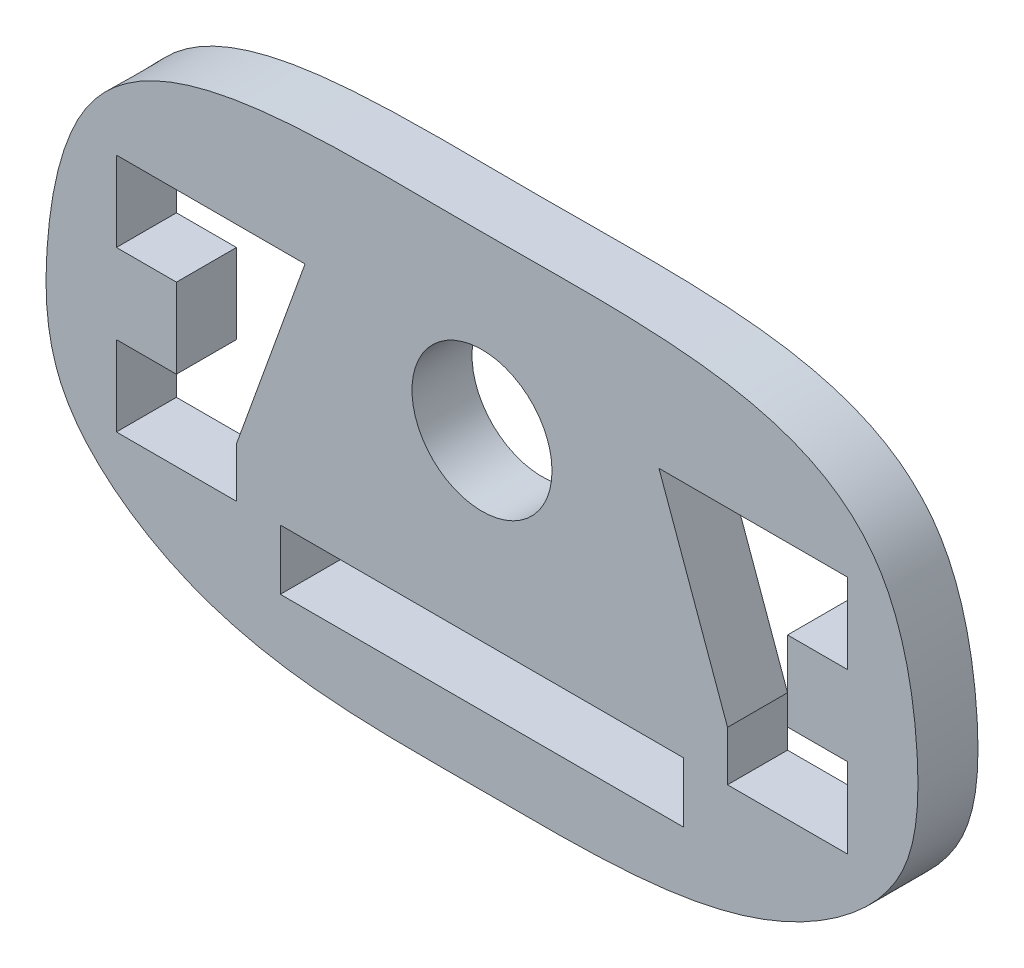
ISO-10303-21;
HEADER;
FILE_DESCRIPTION(('STEP AP214'),'2;1');
FILE_NAME('part.step','',(''),(''),'','','');
FILE_SCHEMA(('AUTOMOTIVE_DESIGN { 1 0 10303 214 1 1 1 1 }'));
ENDSEC;
DATA;
#1=APPLICATION_CONTEXT('core data for automotive mechanical design processes');
#2=APPLICATION_PROTOCOL_DEFINITION('international standard','automotive_design',2000,#1);
#3=PRODUCT_CONTEXT('',#1,'mechanical');
#4=PRODUCT('Part','Part','',(#3));
#5=PRODUCT_RELATED_PRODUCT_CATEGORY('part','',(#4));
#6=PRODUCT_DEFINITION_FORMATION('','',#4);
#7=PRODUCT_DEFINITION_CONTEXT('part definition',#1,'design');
#8=PRODUCT_DEFINITION('design','',#6,#7);
#9=PRODUCT_DEFINITION_SHAPE('','',#8);
#10=(LENGTH_UNIT() NAMED_UNIT(*) SI_UNIT(.MILLI.,.METRE.));
#11=(NAMED_UNIT(*) PLANE_ANGLE_UNIT() SI_UNIT($,.RADIAN.));
#12=(NAMED_UNIT(*) SI_UNIT($,.STERADIAN.) SOLID_ANGLE_UNIT());
#13=UNCERTAINTY_MEASURE_WITH_UNIT(LENGTH_MEASURE(1.E-05),#10,'distance_accuracy_value','');
#14=(GEOMETRIC_REPRESENTATION_CONTEXT(3) GLOBAL_UNCERTAINTY_ASSIGNED_CONTEXT((#13)) GLOBAL_UNIT_ASSIGNED_CONTEXT((#10,
#11,#12)) REPRESENTATION_CONTEXT('',''));
#15=CARTESIAN_POINT('',(0.,0.,0.));
#16=DIRECTION('',(0.,0.,1.));
#17=DIRECTION('',(1.,0.,0.));
#18=AXIS2_PLACEMENT_3D('',#15,#16,#17);
#19=CARTESIAN_POINT('',(0.,8.587,-3.));
#20=CARTESIAN_POINT('',(-8.29531286168411,8.587,-3.));
#21=CARTESIAN_POINT('',(-19.5336080047196,9.37448352417884,-3.));
#22=CARTESIAN_POINT('',(-21.9957741214908,-2.52883560372019,-3.));
#23=CARTESIAN_POINT('',(-21.673613050619,-9.04529162390971,-3.));
#24=CARTESIAN_POINT('',(-13.850048985814,-15.8842034140254,-3.));
#25=CARTESIAN_POINT('',(0.,-15.3682614883277,-3.));
#26=CARTESIAN_POINT('',(13.850048985814,-15.8842034140254,-3.));
#27=CARTESIAN_POINT('',(21.673613050619,-9.04529162390971,-3.));
#28=CARTESIAN_POINT('',(21.9957741214908,-2.52883560372018,-3.));
#29=CARTESIAN_POINT('',(19.5336080047196,9.37448352417884,-3.));
#30=CARTESIAN_POINT('',(8.29531286168411,8.587,-3.));
#31=CARTESIAN_POINT('',(0.,8.587,-3.));
#32=B_SPLINE_CURVE_WITH_KNOTS('',3,(#19,#20,#21,#22,#23,#24,#25,#26,#27,#28,#29,#30,#31),
.UNSPECIFIED.,.T.,.F.,(4,1,1,1,1,1,1,1,1,1,4),(0.,0.181616285688186,0.24604948063783,
0.295476386667812,0.349472823423533,0.5,0.650527176576467,0.704523613332188,0.753950519362169,
0.818383714311814,1.),.UNSPECIFIED.);
#33=DIRECTION('',(0.,0.,1.));
#34=VECTOR('',#33,1.);
#35=SURFACE_OF_LINEAR_EXTRUSION('',#32,#34);
#36=CARTESIAN_POINT('',(0.,8.587,-3.));
#37=VERTEX_POINT('',#36);
#38=EDGE_CURVE('E11',#37,#37,#32,.T.);
#39=ORIENTED_EDGE('',*,*,#38,.T.);
#40=EDGE_LOOP('',(#39));
#41=FACE_BOUND('',#40,.T.);
#42=CARTESIAN_POINT('',(0.,8.587,0.));
#43=CARTESIAN_POINT('',(-8.29531286168411,8.587,0.));
#44=CARTESIAN_POINT('',(-19.5336080047196,9.37448352417884,0.));
#45=CARTESIAN_POINT('',(-21.9957741214908,-2.52883560372019,0.));
#46=CARTESIAN_POINT('',(-21.673613050619,-9.04529162390971,0.));
#47=CARTESIAN_POINT('',(-13.850048985814,-15.8842034140254,0.));
#48=CARTESIAN_POINT('',(0.,-15.3682614883277,0.));
#49=CARTESIAN_POINT('',(13.850048985814,-15.8842034140254,0.));
#50=CARTESIAN_POINT('',(21.673613050619,-9.04529162390971,0.));
#51=CARTESIAN_POINT('',(21.9957741214908,-2.52883560372018,0.));
#52=CARTESIAN_POINT('',(19.5336080047196,9.37448352417884,0.));
#53=CARTESIAN_POINT('',(8.29531286168411,8.587,0.));
#54=CARTESIAN_POINT('',(0.,8.587,0.));
#55=B_SPLINE_CURVE_WITH_KNOTS('',3,(#42,#43,#44,#45,#46,#47,#48,#49,#50,#51,#52,#53,#54),
.UNSPECIFIED.,.T.,.F.,(4,1,1,1,1,1,1,1,1,1,4),(0.,0.181616285688186,0.24604948063783,
0.295476386667812,0.349472823423533,0.5,0.650527176576467,0.704523613332188,0.753950519362169,
0.818383714311814,1.),.UNSPECIFIED.);
#56=CARTESIAN_POINT('',(0.,8.587,0.));
#57=VERTEX_POINT('',#56);
#58=EDGE_CURVE('E37',#57,#57,#55,.T.);
#59=ORIENTED_EDGE('',*,*,#58,.F.);
#60=EDGE_LOOP('',(#59));
#61=FACE_BOUND('',#60,.T.);
#62=ADVANCED_FACE('F33',(#41,#61),#35,.T.);
#63=CARTESIAN_POINT('',(0.,-15.587,-3.));
#64=DIRECTION('',(0.,0.,1.));
#65=DIRECTION('',(1.,0.,0.));
#66=AXIS2_PLACEMENT_3D('',#63,#64,#65);
#67=PLANE('',#66);
#68=DIRECTION('',(0.339332996233841,-0.940666315792675,0.));
#69=VECTOR('',#68,1.);
#70=CARTESIAN_POINT('',(12.273,-6.715,-3.));
#71=LINE('',#70,#69);
#72=CARTESIAN_POINT('',(8.846,2.785,-3.));
#73=VERTEX_POINT('',#72);
#74=CARTESIAN_POINT('',(12.273,-6.715,-3.));
#75=VERTEX_POINT('',#74);
#76=EDGE_CURVE('E191',#73,#75,#71,.T.);
#77=ORIENTED_EDGE('',*,*,#76,.T.);
#78=DIRECTION('',(0.,-1.,0.));
#79=VECTOR('',#78,1.);
#80=CARTESIAN_POINT('',(12.273,-9.202,-3.));
#81=LINE('',#80,#79);
#82=CARTESIAN_POINT('',(12.273,-9.202,-3.));
#83=VERTEX_POINT('',#82);
#84=EDGE_CURVE('E185',#75,#83,#81,.T.);
#85=ORIENTED_EDGE('',*,*,#84,.T.);
#86=DIRECTION('',(1.,0.,0.));
#87=VECTOR('',#86,1.);
#88=CARTESIAN_POINT('',(18.273,-9.202,-3.));
#89=LINE('',#88,#87);
#90=CARTESIAN_POINT('',(18.273,-9.202,-3.));
#91=VERTEX_POINT('',#90);
#92=EDGE_CURVE('E194',#83,#91,#89,.T.);
#93=ORIENTED_EDGE('',*,*,#92,.T.);
#94=DIRECTION('',(0.,1.,0.));
#95=VECTOR('',#94,1.);
#96=CARTESIAN_POINT('',(18.273,-5.202,-3.));
#97=LINE('',#96,#95);
#98=CARTESIAN_POINT('',(18.273,-5.202,-3.));
#99=VERTEX_POINT('',#98);
#100=EDGE_CURVE('E49',#91,#99,#97,.T.);
#101=ORIENTED_EDGE('',*,*,#100,.T.);
#102=DIRECTION('',(-1.,0.,0.));
#103=VECTOR('',#102,1.);
#104=CARTESIAN_POINT('',(15.273,-5.202,-3.));
#105=LINE('',#104,#103);
#106=CARTESIAN_POINT('',(15.273,-5.202,-3.));
#107=VERTEX_POINT('',#106);
#108=EDGE_CURVE('E209',#99,#107,#105,.T.);
#109=ORIENTED_EDGE('',*,*,#108,.T.);
#110=DIRECTION('',(0.,1.,0.));
#111=VECTOR('',#110,1.);
#112=CARTESIAN_POINT('',(15.273,-1.215,-3.));
#113=LINE('',#112,#111);
#114=CARTESIAN_POINT('',(15.273,-1.215,-3.));
#115=VERTEX_POINT('',#114);
#116=EDGE_CURVE('E212',#107,#115,#113,.T.);
#117=ORIENTED_EDGE('',*,*,#116,.T.);
#118=DIRECTION('',(1.,0.,0.));
#119=VECTOR('',#118,1.);
#120=CARTESIAN_POINT('',(18.273,-1.215,-3.));
#121=LINE('',#120,#119);
#122=CARTESIAN_POINT('',(18.273,-1.215,-3.));
#123=VERTEX_POINT('',#122);
#124=EDGE_CURVE('E215',#115,#123,#121,.T.);
#125=ORIENTED_EDGE('',*,*,#124,.T.);
#126=DIRECTION('',(0.,1.,0.));
#127=VECTOR('',#126,1.);
#128=CARTESIAN_POINT('',(18.273,2.785,-3.));
#129=LINE('',#128,#127);
#130=CARTESIAN_POINT('',(18.273,2.785,-3.));
#131=VERTEX_POINT('',#130);
#132=EDGE_CURVE('E218',#123,#131,#129,.T.);
#133=ORIENTED_EDGE('',*,*,#132,.T.);
#134=DIRECTION('',(-1.,0.,0.));
#135=VECTOR('',#134,1.);
#136=CARTESIAN_POINT('',(8.846,2.785,-3.));
#137=LINE('',#136,#135);
#138=EDGE_CURVE('E221',#131,#73,#137,.T.);
#139=ORIENTED_EDGE('',*,*,#138,.T.);
#140=EDGE_LOOP('',(#77,#85,#93,#101,#109,#117,#125,#133,#139));
#141=FACE_BOUND('',#140,.T.);
#142=DIRECTION('',(1.,0.,0.));
#143=VECTOR('',#142,1.);
#144=CARTESIAN_POINT('',(-10.08,-12.133,-3.));
#145=LINE('',#144,#143);
#146=CARTESIAN_POINT('',(-10.08,-12.133,-3.));
#147=VERTEX_POINT('',#146);
#148=CARTESIAN_POINT('',(10.08,-12.133,-3.));
#149=VERTEX_POINT('',#148);
#150=EDGE_CURVE('E270',#147,#149,#145,.T.);
#151=ORIENTED_EDGE('',*,*,#150,.T.);
#152=DIRECTION('',(0.,1.,0.));
#153=VECTOR('',#152,1.);
#154=CARTESIAN_POINT('',(10.08,-12.133,-3.));
#155=LINE('',#154,#153);
#156=CARTESIAN_POINT('',(10.08,-9.133,-3.));
#157=VERTEX_POINT('',#156);
#158=EDGE_CURVE('E260',#149,#157,#155,.T.);
#159=ORIENTED_EDGE('',*,*,#158,.T.);
#160=DIRECTION('',(-1.,0.,0.));
#161=VECTOR('',#160,1.);
#162=CARTESIAN_POINT('',(-10.08,-9.133,-3.));
#163=LINE('',#162,#161);
#164=CARTESIAN_POINT('',(-10.08,-9.133,-3.));
#165=VERTEX_POINT('',#164);
#166=EDGE_CURVE('E263',#157,#165,#163,.T.);
#167=ORIENTED_EDGE('',*,*,#166,.T.);
#168=DIRECTION('',(0.,-1.,0.));
#169=VECTOR('',#168,1.);
#170=CARTESIAN_POINT('',(-10.08,-9.133,-3.));
#171=LINE('',#170,#169);
#172=EDGE_CURVE('E267',#165,#147,#171,.T.);
#173=ORIENTED_EDGE('',*,*,#172,.T.);
#174=EDGE_LOOP('',(#151,#159,#167,#173));
#175=FACE_BOUND('',#174,.T.);
#176=DIRECTION('',(0.,1.,0.));
#177=VECTOR('',#176,1.);
#178=CARTESIAN_POINT('',(-12.273,-9.202,-3.));
#179=LINE('',#178,#177);
#180=CARTESIAN_POINT('',(-12.273,-9.202,-3.));
#181=VERTEX_POINT('',#180);
#182=CARTESIAN_POINT('',(-12.273,-6.715,-3.));
#183=VERTEX_POINT('',#182);
#184=EDGE_CURVE('E317',#181,#183,#179,.T.);
#185=ORIENTED_EDGE('',*,*,#184,.T.);
#186=DIRECTION('',(0.339332996233841,0.940666315792675,0.));
#187=VECTOR('',#186,1.);
#188=CARTESIAN_POINT('',(-12.273,-6.715,-3.));
#189=LINE('',#188,#187);
#190=CARTESIAN_POINT('',(-8.846,2.785,-3.));
#191=VERTEX_POINT('',#190);
#192=EDGE_CURVE('E292',#183,#191,#189,.T.);
#193=ORIENTED_EDGE('',*,*,#192,.T.);
#194=DIRECTION('',(-1.,0.,0.));
#195=VECTOR('',#194,1.);
#196=CARTESIAN_POINT('',(-8.846,2.785,-3.));
#197=LINE('',#196,#195);
#198=CARTESIAN_POINT('',(-18.273,2.785,-3.));
#199=VERTEX_POINT('',#198);
#200=EDGE_CURVE('E295',#191,#199,#197,.T.);
#201=ORIENTED_EDGE('',*,*,#200,.T.);
#202=DIRECTION('',(0.,-1.,0.));
#203=VECTOR('',#202,1.);
#204=CARTESIAN_POINT('',(-18.273,2.785,-3.));
#205=LINE('',#204,#203);
#206=CARTESIAN_POINT('',(-18.273,-1.215,-3.));
#207=VERTEX_POINT('',#206);
#208=EDGE_CURVE('E299',#199,#207,#205,.T.);
#209=ORIENTED_EDGE('',*,*,#208,.T.);
#210=DIRECTION('',(1.,0.,0.));
#211=VECTOR('',#210,1.);
#212=CARTESIAN_POINT('',(-18.273,-1.215,-3.));
#213=LINE('',#212,#211);
#214=CARTESIAN_POINT('',(-15.273,-1.215,-3.));
#215=VERTEX_POINT('',#214);
#216=EDGE_CURVE('E302',#207,#215,#213,.T.);
#217=ORIENTED_EDGE('',*,*,#216,.T.);
#218=DIRECTION('',(0.,-1.,0.));
#219=VECTOR('',#218,1.);
#220=CARTESIAN_POINT('',(-15.273,-1.215,-3.));
#221=LINE('',#220,#219);
#222=CARTESIAN_POINT('',(-15.273,-5.202,-3.));
#223=VERTEX_POINT('',#222);
#224=EDGE_CURVE('E305',#215,#223,#221,.T.);
#225=ORIENTED_EDGE('',*,*,#224,.T.);
#226=DIRECTION('',(-1.,0.,0.));
#227=VECTOR('',#226,1.);
#228=CARTESIAN_POINT('',(-15.273,-5.202,-3.));
#229=LINE('',#228,#227);
#230=CARTESIAN_POINT('',(-18.273,-5.202,-3.));
#231=VERTEX_POINT('',#230);
#232=EDGE_CURVE('E308',#223,#231,#229,.T.);
#233=ORIENTED_EDGE('',*,*,#232,.T.);
#234=DIRECTION('',(0.,-1.,0.));
#235=VECTOR('',#234,1.);
#236=CARTESIAN_POINT('',(-18.273,-5.202,-3.));
#237=LINE('',#236,#235);
#238=CARTESIAN_POINT('',(-18.273,-9.202,-3.));
#239=VERTEX_POINT('',#238);
#240=EDGE_CURVE('E311',#231,#239,#237,.T.);
#241=ORIENTED_EDGE('',*,*,#240,.T.);
#242=DIRECTION('',(1.,0.,0.));
#243=VECTOR('',#242,1.);
#244=CARTESIAN_POINT('',(-18.273,-9.202,-3.));
#245=LINE('',#244,#243);
#246=EDGE_CURVE('E314',#239,#181,#245,.T.);
#247=ORIENTED_EDGE('',*,*,#246,.T.);
#248=EDGE_LOOP('',(#185,#193,#201,#209,#217,#225,#233,#241,#247));
#249=FACE_BOUND('',#248,.T.);
#250=CARTESIAN_POINT('',(0.,0.,-3.));
#251=DIRECTION('',(0.,0.,1.));
#252=DIRECTION('',(1.,0.,0.));
#253=AXIS2_PLACEMENT_3D('',#250,#251,#252);
#254=CIRCLE('',#253,3.5);
#255=CARTESIAN_POINT('',(3.5,0.,-3.));
#256=VERTEX_POINT('',#255);
#257=EDGE_CURVE('E364',#256,#256,#254,.T.);
#258=ORIENTED_EDGE('',*,*,#257,.T.);
#259=EDGE_LOOP('',(#258));
#260=FACE_BOUND('',#259,.T.);
#261=ORIENTED_EDGE('',*,*,#38,.F.);
#262=EDGE_LOOP('',(#261));
#263=FACE_BOUND('',#262,.T.);
#264=ADVANCED_FACE('F198',(#141,#175,#249,#260,#263),#67,.F.);
#265=CARTESIAN_POINT('',(0.,-15.587,0.));
#266=DIRECTION('',(0.,0.,1.));
#267=DIRECTION('',(1.,0.,0.));
#268=AXIS2_PLACEMENT_3D('',#265,#266,#267);
#269=PLANE('',#268);
#270=DIRECTION('',(0.,-1.,0.));
#271=VECTOR('',#270,1.);
#272=CARTESIAN_POINT('',(12.273,-9.202,0.));
#273=LINE('',#272,#271);
#274=CARTESIAN_POINT('',(12.273,-6.715,0.));
#275=VERTEX_POINT('',#274);
#276=CARTESIAN_POINT('',(12.273,-9.202,0.));
#277=VERTEX_POINT('',#276);
#278=EDGE_CURVE('E57',#275,#277,#273,.T.);
#279=ORIENTED_EDGE('',*,*,#278,.F.);
#280=DIRECTION('',(0.339332996233841,-0.940666315792675,0.));
#281=VECTOR('',#280,1.);
#282=CARTESIAN_POINT('',(12.273,-6.715,0.));
#283=LINE('',#282,#281);
#284=CARTESIAN_POINT('',(8.846,2.785,0.));
#285=VERTEX_POINT('',#284);
#286=EDGE_CURVE('E202',#285,#275,#283,.T.);
#287=ORIENTED_EDGE('',*,*,#286,.F.);
#288=DIRECTION('',(-1.,0.,0.));
#289=VECTOR('',#288,1.);
#290=CARTESIAN_POINT('',(8.846,2.785,0.));
#291=LINE('',#290,#289);
#292=CARTESIAN_POINT('',(18.273,2.785,0.));
#293=VERTEX_POINT('',#292);
#294=EDGE_CURVE('E205',#293,#285,#291,.T.);
#295=ORIENTED_EDGE('',*,*,#294,.F.);
#296=DIRECTION('',(0.,1.,0.));
#297=VECTOR('',#296,1.);
#298=CARTESIAN_POINT('',(18.273,2.785,0.));
#299=LINE('',#298,#297);
#300=CARTESIAN_POINT('',(18.273,-1.215,0.));
#301=VERTEX_POINT('',#300);
#302=EDGE_CURVE('E239',#301,#293,#299,.T.);
#303=ORIENTED_EDGE('',*,*,#302,.F.);
#304=DIRECTION('',(1.,0.,0.));
#305=VECTOR('',#304,1.);
#306=CARTESIAN_POINT('',(18.273,-1.215,0.));
#307=LINE('',#306,#305);
#308=CARTESIAN_POINT('',(15.273,-1.215,0.));
#309=VERTEX_POINT('',#308);
#310=EDGE_CURVE('E236',#309,#301,#307,.T.);
#311=ORIENTED_EDGE('',*,*,#310,.F.);
#312=DIRECTION('',(0.,1.,0.));
#313=VECTOR('',#312,1.);
#314=CARTESIAN_POINT('',(15.273,-1.215,0.));
#315=LINE('',#314,#313);
#316=CARTESIAN_POINT('',(15.273,-5.202,0.));
#317=VERTEX_POINT('',#316);
#318=EDGE_CURVE('E233',#317,#309,#315,.T.);
#319=ORIENTED_EDGE('',*,*,#318,.F.);
#320=DIRECTION('',(-1.,0.,0.));
#321=VECTOR('',#320,1.);
#322=CARTESIAN_POINT('',(15.273,-5.202,0.));
#323=LINE('',#322,#321);
#324=CARTESIAN_POINT('',(18.273,-5.202,0.));
#325=VERTEX_POINT('',#324);
#326=EDGE_CURVE('E230',#325,#317,#323,.T.);
#327=ORIENTED_EDGE('',*,*,#326,.F.);
#328=DIRECTION('',(0.,1.,0.));
#329=VECTOR('',#328,1.);
#330=CARTESIAN_POINT('',(18.273,-5.202,0.));
#331=LINE('',#330,#329);
#332=CARTESIAN_POINT('',(18.273,-9.202,0.));
#333=VERTEX_POINT('',#332);
#334=EDGE_CURVE('E227',#333,#325,#331,.T.);
#335=ORIENTED_EDGE('',*,*,#334,.F.);
#336=DIRECTION('',(1.,0.,0.));
#337=VECTOR('',#336,1.);
#338=CARTESIAN_POINT('',(18.273,-9.202,0.));
#339=LINE('',#338,#337);
#340=EDGE_CURVE('E225',#277,#333,#339,.T.);
#341=ORIENTED_EDGE('',*,*,#340,.F.);
#342=EDGE_LOOP('',(#279,#287,#295,#303,#311,#319,#327,#335,#341));
#343=FACE_BOUND('',#342,.T.);
#344=DIRECTION('',(0.,1.,0.));
#345=VECTOR('',#344,1.);
#346=CARTESIAN_POINT('',(10.08,-12.133,0.));
#347=LINE('',#346,#345);
#348=CARTESIAN_POINT('',(10.08,-12.133,0.));
#349=VERTEX_POINT('',#348);
#350=CARTESIAN_POINT('',(10.08,-9.133,0.));
#351=VERTEX_POINT('',#350);
#352=EDGE_CURVE('E246',#349,#351,#347,.T.);
#353=ORIENTED_EDGE('',*,*,#352,.F.);
#354=DIRECTION('',(1.,0.,0.));
#355=VECTOR('',#354,1.);
#356=CARTESIAN_POINT('',(-10.08,-12.133,0.));
#357=LINE('',#356,#355);
#358=CARTESIAN_POINT('',(-10.08,-12.133,0.));
#359=VERTEX_POINT('',#358);
#360=EDGE_CURVE('E264',#359,#349,#357,.T.);
#361=ORIENTED_EDGE('',*,*,#360,.F.);
#362=DIRECTION('',(0.,-1.,0.));
#363=VECTOR('',#362,1.);
#364=CARTESIAN_POINT('',(-10.08,-9.133,0.));
#365=LINE('',#364,#363);
#366=CARTESIAN_POINT('',(-10.08,-9.133,0.));
#367=VERTEX_POINT('',#366);
#368=EDGE_CURVE('E278',#367,#359,#365,.T.);
#369=ORIENTED_EDGE('',*,*,#368,.F.);
#370=DIRECTION('',(-1.,0.,0.));
#371=VECTOR('',#370,1.);
#372=CARTESIAN_POINT('',(-10.08,-9.133,0.));
#373=LINE('',#372,#371);
#374=EDGE_CURVE('E275',#351,#367,#373,.T.);
#375=ORIENTED_EDGE('',*,*,#374,.F.);
#376=EDGE_LOOP('',(#353,#361,#369,#375));
#377=FACE_BOUND('',#376,.T.);
#378=DIRECTION('',(0.339332996233841,0.940666315792675,0.));
#379=VECTOR('',#378,1.);
#380=CARTESIAN_POINT('',(-12.273,-6.715,0.));
#381=LINE('',#380,#379);
#382=CARTESIAN_POINT('',(-12.273,-6.715,0.));
#383=VERTEX_POINT('',#382);
#384=CARTESIAN_POINT('',(-8.846,2.785,0.));
#385=VERTEX_POINT('',#384);
#386=EDGE_CURVE('E285',#383,#385,#381,.T.);
#387=ORIENTED_EDGE('',*,*,#386,.F.);
#388=DIRECTION('',(0.,1.,0.));
#389=VECTOR('',#388,1.);
#390=CARTESIAN_POINT('',(-12.273,-9.202,0.));
#391=LINE('',#390,#389);
#392=CARTESIAN_POINT('',(-12.273,-9.202,0.));
#393=VERTEX_POINT('',#392);
#394=EDGE_CURVE('E296',#393,#383,#391,.T.);
#395=ORIENTED_EDGE('',*,*,#394,.F.);
#396=DIRECTION('',(1.,0.,0.));
#397=VECTOR('',#396,1.);
#398=CARTESIAN_POINT('',(-18.273,-9.202,0.));
#399=LINE('',#398,#397);
#400=CARTESIAN_POINT('',(-18.273,-9.202,0.));
#401=VERTEX_POINT('',#400);
#402=EDGE_CURVE('E340',#401,#393,#399,.T.);
#403=ORIENTED_EDGE('',*,*,#402,.F.);
#404=DIRECTION('',(0.,-1.,0.));
#405=VECTOR('',#404,1.);
#406=CARTESIAN_POINT('',(-18.273,-5.202,0.));
#407=LINE('',#406,#405);
#408=CARTESIAN_POINT('',(-18.273,-5.202,0.));
#409=VERTEX_POINT('',#408);
#410=EDGE_CURVE('E337',#409,#401,#407,.T.);
#411=ORIENTED_EDGE('',*,*,#410,.F.);
#412=DIRECTION('',(-1.,0.,0.));
#413=VECTOR('',#412,1.);
#414=CARTESIAN_POINT('',(-15.273,-5.202,0.));
#415=LINE('',#414,#413);
#416=CARTESIAN_POINT('',(-15.273,-5.202,0.));
#417=VERTEX_POINT('',#416);
#418=EDGE_CURVE('E334',#417,#409,#415,.T.);
#419=ORIENTED_EDGE('',*,*,#418,.F.);
#420=DIRECTION('',(0.,-1.,0.));
#421=VECTOR('',#420,1.);
#422=CARTESIAN_POINT('',(-15.273,-1.215,0.));
#423=LINE('',#422,#421);
#424=CARTESIAN_POINT('',(-15.273,-1.215,0.));
#425=VERTEX_POINT('',#424);
#426=EDGE_CURVE('E331',#425,#417,#423,.T.);
#427=ORIENTED_EDGE('',*,*,#426,.F.);
#428=DIRECTION('',(1.,0.,0.));
#429=VECTOR('',#428,1.);
#430=CARTESIAN_POINT('',(-18.273,-1.215,0.));
#431=LINE('',#430,#429);
#432=CARTESIAN_POINT('',(-18.273,-1.215,0.));
#433=VERTEX_POINT('',#432);
#434=EDGE_CURVE('E328',#433,#425,#431,.T.);
#435=ORIENTED_EDGE('',*,*,#434,.F.);
#436=DIRECTION('',(0.,-1.,0.));
#437=VECTOR('',#436,1.);
#438=CARTESIAN_POINT('',(-18.273,2.785,0.));
#439=LINE('',#438,#437);
#440=CARTESIAN_POINT('',(-18.273,2.785,0.));
#441=VERTEX_POINT('',#440);
#442=EDGE_CURVE('E325',#441,#433,#439,.T.);
#443=ORIENTED_EDGE('',*,*,#442,.F.);
#444=DIRECTION('',(-1.,0.,0.));
#445=VECTOR('',#444,1.);
#446=CARTESIAN_POINT('',(-8.846,2.785,0.));
#447=LINE('',#446,#445);
#448=EDGE_CURVE('E322',#385,#441,#447,.T.);
#449=ORIENTED_EDGE('',*,*,#448,.F.);
#450=EDGE_LOOP('',(#387,#395,#403,#411,#419,#427,#435,#443,#449));
#451=FACE_BOUND('',#450,.T.);
#452=CARTESIAN_POINT('',(0.,0.,0.));
#453=DIRECTION('',(0.,0.,1.));
#454=DIRECTION('',(1.,0.,0.));
#455=AXIS2_PLACEMENT_3D('',#452,#453,#454);
#456=CIRCLE('',#455,3.5);
#457=CARTESIAN_POINT('',(3.5,0.,0.));
#458=VERTEX_POINT('',#457);
#459=EDGE_CURVE('E347',#458,#458,#456,.T.);
#460=ORIENTED_EDGE('',*,*,#459,.F.);
#461=EDGE_LOOP('',(#460));
#462=FACE_BOUND('',#461,.T.);
#463=ORIENTED_EDGE('',*,*,#58,.T.);
#464=EDGE_LOOP('',(#463));
#465=FACE_BOUND('',#464,.T.);
#466=ADVANCED_FACE('F378',(#343,#377,#451,#462,#465),#269,.T.);
#467=CARTESIAN_POINT('',(0.,0.,-3.));
#468=DIRECTION('',(0.,0.,1.));
#469=DIRECTION('',(1.,0.,0.));
#470=AXIS2_PLACEMENT_3D('',#467,#468,#469);
#471=CYLINDRICAL_SURFACE('',#470,3.5);
#472=ORIENTED_EDGE('',*,*,#257,.F.);
#473=EDGE_LOOP('',(#472));
#474=FACE_BOUND('',#473,.T.);
#475=ORIENTED_EDGE('',*,*,#459,.T.);
#476=EDGE_LOOP('',(#475));
#477=FACE_BOUND('',#476,.T.);
#478=ADVANCED_FACE('F376',(#474,#477),#471,.F.);
#479=CARTESIAN_POINT('',(-12.273,-6.715,-3.));
#480=DIRECTION('',(0.940666315792674,-0.339332996233841,0.));
#481=DIRECTION('',(0.339332996233841,0.940666315792675,0.));
#482=AXIS2_PLACEMENT_3D('',#479,#480,#481);
#483=PLANE('',#482);
#484=ORIENTED_EDGE('',*,*,#386,.T.);
#485=DIRECTION('',(0.,0.,1.));
#486=VECTOR('',#485,1.);
#487=CARTESIAN_POINT('',(-8.846,2.785,-3.));
#488=LINE('',#487,#486);
#489=EDGE_CURVE('E320',#191,#385,#488,.T.);
#490=ORIENTED_EDGE('',*,*,#489,.F.);
#491=ORIENTED_EDGE('',*,*,#192,.F.);
#492=DIRECTION('',(0.,0.,1.));
#493=VECTOR('',#492,1.);
#494=CARTESIAN_POINT('',(-12.273,-6.715,-3.));
#495=LINE('',#494,#493);
#496=EDGE_CURVE('E345',#183,#383,#495,.T.);
#497=ORIENTED_EDGE('',*,*,#496,.T.);
#498=EDGE_LOOP('',(#484,#490,#491,#497));
#499=FACE_BOUND('',#498,.T.);
#500=ADVANCED_FACE('F398',(#499),#483,.F.);
#501=CARTESIAN_POINT('',(-12.273,-9.202,-3.));
#502=DIRECTION('',(1.,0.,0.));
#503=DIRECTION('',(0.,0.,-1.));
#504=AXIS2_PLACEMENT_3D('',#501,#502,#503);
#505=PLANE('',#504);
#506=ORIENTED_EDGE('',*,*,#394,.T.);
#507=ORIENTED_EDGE('',*,*,#496,.F.);
#508=ORIENTED_EDGE('',*,*,#184,.F.);
#509=DIRECTION('',(0.,0.,1.));
#510=VECTOR('',#509,1.);
#511=CARTESIAN_POINT('',(-12.273,-9.202,-3.));
#512=LINE('',#511,#510);
#513=EDGE_CURVE('E348',#181,#393,#512,.T.);
#514=ORIENTED_EDGE('',*,*,#513,.T.);
#515=EDGE_LOOP('',(#506,#507,#508,#514));
#516=FACE_BOUND('',#515,.T.);
#517=ADVANCED_FACE('F402',(#516),#505,.F.);
#518=CARTESIAN_POINT('',(-18.273,-9.202,-3.));
#519=DIRECTION('',(0.,-1.,0.));
#520=DIRECTION('',(0.,0.,-1.));
#521=AXIS2_PLACEMENT_3D('',#518,#519,#520);
#522=PLANE('',#521);
#523=ORIENTED_EDGE('',*,*,#402,.T.);
#524=ORIENTED_EDGE('',*,*,#513,.F.);
#525=ORIENTED_EDGE('',*,*,#246,.F.);
#526=DIRECTION('',(0.,0.,1.));
#527=VECTOR('',#526,1.);
#528=CARTESIAN_POINT('',(-18.273,-9.202,-3.));
#529=LINE('',#528,#527);
#530=EDGE_CURVE('E350',#239,#401,#529,.T.);
#531=ORIENTED_EDGE('',*,*,#530,.T.);
#532=EDGE_LOOP('',(#523,#524,#525,#531));
#533=FACE_BOUND('',#532,.T.);
#534=ADVANCED_FACE('F428',(#533),#522,.F.);
#535=CARTESIAN_POINT('',(-18.273,-5.202,-3.));
#536=DIRECTION('',(-1.,0.,0.));
#537=DIRECTION('',(0.,0.,1.));
#538=AXIS2_PLACEMENT_3D('',#535,#536,#537);
#539=PLANE('',#538);
#540=ORIENTED_EDGE('',*,*,#410,.T.);
#541=ORIENTED_EDGE('',*,*,#530,.F.);
#542=ORIENTED_EDGE('',*,*,#240,.F.);
#543=DIRECTION('',(0.,0.,1.));
#544=VECTOR('',#543,1.);
#545=CARTESIAN_POINT('',(-18.273,-5.202,-3.));
#546=LINE('',#545,#544);
#547=EDGE_CURVE('E352',#231,#409,#546,.T.);
#548=ORIENTED_EDGE('',*,*,#547,.T.);
#549=EDGE_LOOP('',(#540,#541,#542,#548));
#550=FACE_BOUND('',#549,.T.);
#551=ADVANCED_FACE('F424',(#550),#539,.F.);
#552=CARTESIAN_POINT('',(-15.273,-5.202,-3.));
#553=DIRECTION('',(0.,1.,0.));
#554=DIRECTION('',(0.,0.,1.));
#555=AXIS2_PLACEMENT_3D('',#552,#553,#554);
#556=PLANE('',#555);
#557=ORIENTED_EDGE('',*,*,#418,.T.);
#558=ORIENTED_EDGE('',*,*,#547,.F.);
#559=ORIENTED_EDGE('',*,*,#232,.F.);
#560=DIRECTION('',(0.,0.,1.));
#561=VECTOR('',#560,1.);
#562=CARTESIAN_POINT('',(-15.273,-5.202,-3.));
#563=LINE('',#562,#561);
#564=EDGE_CURVE('E354',#223,#417,#563,.T.);
#565=ORIENTED_EDGE('',*,*,#564,.T.);
#566=EDGE_LOOP('',(#557,#558,#559,#565));
#567=FACE_BOUND('',#566,.T.);
#568=ADVANCED_FACE('F420',(#567),#556,.F.);
#569=CARTESIAN_POINT('',(-15.273,-1.215,-3.));
#570=DIRECTION('',(-1.,0.,0.));
#571=DIRECTION('',(0.,0.,1.));
#572=AXIS2_PLACEMENT_3D('',#569,#570,#571);
#573=PLANE('',#572);
#574=ORIENTED_EDGE('',*,*,#426,.T.);
#575=ORIENTED_EDGE('',*,*,#564,.F.);
#576=ORIENTED_EDGE('',*,*,#224,.F.);
#577=DIRECTION('',(0.,0.,1.));
#578=VECTOR('',#577,1.);
#579=CARTESIAN_POINT('',(-15.273,-1.215,-3.));
#580=LINE('',#579,#578);
#581=EDGE_CURVE('E356',#215,#425,#580,.T.);
#582=ORIENTED_EDGE('',*,*,#581,.T.);
#583=EDGE_LOOP('',(#574,#575,#576,#582));
#584=FACE_BOUND('',#583,.T.);
#585=ADVANCED_FACE('F416',(#584),#573,.F.);
#586=CARTESIAN_POINT('',(-18.273,-1.215,-3.));
#587=DIRECTION('',(0.,-1.,0.));
#588=DIRECTION('',(0.,0.,-1.));
#589=AXIS2_PLACEMENT_3D('',#586,#587,#588);
#590=PLANE('',#589);
#591=ORIENTED_EDGE('',*,*,#434,.T.);
#592=ORIENTED_EDGE('',*,*,#581,.F.);
#593=ORIENTED_EDGE('',*,*,#216,.F.);
#594=DIRECTION('',(0.,0.,1.));
#595=VECTOR('',#594,1.);
#596=CARTESIAN_POINT('',(-18.273,-1.215,-3.));
#597=LINE('',#596,#595);
#598=EDGE_CURVE('E358',#207,#433,#597,.T.);
#599=ORIENTED_EDGE('',*,*,#598,.T.);
#600=EDGE_LOOP('',(#591,#592,#593,#599));
#601=FACE_BOUND('',#600,.T.);
#602=ADVANCED_FACE('F412',(#601),#590,.F.);
#603=CARTESIAN_POINT('',(-18.273,2.785,-3.));
#604=DIRECTION('',(-1.,0.,0.));
#605=DIRECTION('',(0.,0.,1.));
#606=AXIS2_PLACEMENT_3D('',#603,#604,#605);
#607=PLANE('',#606);
#608=ORIENTED_EDGE('',*,*,#442,.T.);
#609=ORIENTED_EDGE('',*,*,#598,.F.);
#610=ORIENTED_EDGE('',*,*,#208,.F.);
#611=DIRECTION('',(0.,0.,1.));
#612=VECTOR('',#611,1.);
#613=CARTESIAN_POINT('',(-18.273,2.785,-3.));
#614=LINE('',#613,#612);
#615=EDGE_CURVE('E360',#199,#441,#614,.T.);
#616=ORIENTED_EDGE('',*,*,#615,.T.);
#617=EDGE_LOOP('',(#608,#609,#610,#616));
#618=FACE_BOUND('',#617,.T.);
#619=ADVANCED_FACE('F408',(#618),#607,.F.);
#620=CARTESIAN_POINT('',(-8.846,2.785,-3.));
#621=DIRECTION('',(0.,1.,0.));
#622=DIRECTION('',(-1.,0.,0.));
#623=AXIS2_PLACEMENT_3D('',#620,#621,#622);
#624=PLANE('',#623);
#625=ORIENTED_EDGE('',*,*,#448,.T.);
#626=ORIENTED_EDGE('',*,*,#615,.F.);
#627=ORIENTED_EDGE('',*,*,#200,.F.);
#628=ORIENTED_EDGE('',*,*,#489,.T.);
#629=EDGE_LOOP('',(#625,#626,#627,#628));
#630=FACE_BOUND('',#629,.T.);
#631=ADVANCED_FACE('F404',(#630),#624,.F.);
#632=CARTESIAN_POINT('',(10.08,-12.133,-3.));
#633=DIRECTION('',(1.,0.,0.));
#634=DIRECTION('',(0.,0.,-1.));
#635=AXIS2_PLACEMENT_3D('',#632,#633,#634);
#636=PLANE('',#635);
#637=ORIENTED_EDGE('',*,*,#352,.T.);
#638=DIRECTION('',(0.,0.,1.));
#639=VECTOR('',#638,1.);
#640=CARTESIAN_POINT('',(10.08,-9.133,-3.));
#641=LINE('',#640,#639);
#642=EDGE_CURVE('E273',#157,#351,#641,.T.);
#643=ORIENTED_EDGE('',*,*,#642,.F.);
#644=ORIENTED_EDGE('',*,*,#158,.F.);
#645=DIRECTION('',(0.,0.,1.));
#646=VECTOR('',#645,1.);
#647=CARTESIAN_POINT('',(10.08,-12.133,-3.));
#648=LINE('',#647,#646);
#649=EDGE_CURVE('E283',#149,#349,#648,.T.);
#650=ORIENTED_EDGE('',*,*,#649,.T.);
#651=EDGE_LOOP('',(#637,#643,#644,#650));
#652=FACE_BOUND('',#651,.T.);
#653=ADVANCED_FACE('F407',(#652),#636,.F.);
#654=CARTESIAN_POINT('',(-10.08,-12.133,-3.));
#655=DIRECTION('',(0.,-1.,0.));
#656=DIRECTION('',(1.,0.,0.));
#657=AXIS2_PLACEMENT_3D('',#654,#655,#656);
#658=PLANE('',#657);
#659=ORIENTED_EDGE('',*,*,#360,.T.);
#660=ORIENTED_EDGE('',*,*,#649,.F.);
#661=ORIENTED_EDGE('',*,*,#150,.F.);
#662=DIRECTION('',(0.,0.,1.));
#663=VECTOR('',#662,1.);
#664=CARTESIAN_POINT('',(-10.08,-12.133,-3.));
#665=LINE('',#664,#663);
#666=EDGE_CURVE('E286',#147,#359,#665,.T.);
#667=ORIENTED_EDGE('',*,*,#666,.T.);
#668=EDGE_LOOP('',(#659,#660,#661,#667));
#669=FACE_BOUND('',#668,.T.);
#670=ADVANCED_FACE('F438',(#669),#658,.F.);
#671=CARTESIAN_POINT('',(-10.08,-9.133,-3.));
#672=DIRECTION('',(-1.,0.,0.));
#673=DIRECTION('',(0.,0.,1.));
#674=AXIS2_PLACEMENT_3D('',#671,#672,#673);
#675=PLANE('',#674);
#676=ORIENTED_EDGE('',*,*,#368,.T.);
#677=ORIENTED_EDGE('',*,*,#666,.F.);
#678=ORIENTED_EDGE('',*,*,#172,.F.);
#679=DIRECTION('',(0.,0.,1.));
#680=VECTOR('',#679,1.);
#681=CARTESIAN_POINT('',(-10.08,-9.133,-3.));
#682=LINE('',#681,#680);
#683=EDGE_CURVE('E288',#165,#367,#682,.T.);
#684=ORIENTED_EDGE('',*,*,#683,.T.);
#685=EDGE_LOOP('',(#676,#677,#678,#684));
#686=FACE_BOUND('',#685,.T.);
#687=ADVANCED_FACE('F443',(#686),#675,.F.);
#688=CARTESIAN_POINT('',(-10.08,-9.133,-3.));
#689=DIRECTION('',(0.,1.,0.));
#690=DIRECTION('',(-1.,0.,0.));
#691=AXIS2_PLACEMENT_3D('',#688,#689,#690);
#692=PLANE('',#691);
#693=ORIENTED_EDGE('',*,*,#374,.T.);
#694=ORIENTED_EDGE('',*,*,#683,.F.);
#695=ORIENTED_EDGE('',*,*,#166,.F.);
#696=ORIENTED_EDGE('',*,*,#642,.T.);
#697=EDGE_LOOP('',(#693,#694,#695,#696));
#698=FACE_BOUND('',#697,.T.);
#699=ADVANCED_FACE('F440',(#698),#692,.F.);
#700=CARTESIAN_POINT('',(12.273,-9.202,-3.));
#701=DIRECTION('',(-1.,0.,0.));
#702=DIRECTION('',(0.,-1.,0.));
#703=AXIS2_PLACEMENT_3D('',#700,#701,#702);
#704=PLANE('',#703);
#705=ORIENTED_EDGE('',*,*,#278,.T.);
#706=DIRECTION('',(0.,0.,1.));
#707=VECTOR('',#706,1.);
#708=CARTESIAN_POINT('',(12.273,-9.202,-3.));
#709=LINE('',#708,#707);
#710=EDGE_CURVE('E181',#83,#277,#709,.T.);
#711=ORIENTED_EDGE('',*,*,#710,.F.);
#712=ORIENTED_EDGE('',*,*,#84,.F.);
#713=DIRECTION('',(0.,0.,1.));
#714=VECTOR('',#713,1.);
#715=CARTESIAN_POINT('',(12.273,-6.715,-3.));
#716=LINE('',#715,#714);
#717=EDGE_CURVE('E244',#75,#275,#716,.T.);
#718=ORIENTED_EDGE('',*,*,#717,.T.);
#719=EDGE_LOOP('',(#705,#711,#712,#718));
#720=FACE_BOUND('',#719,.T.);
#721=ADVANCED_FACE('F183',(#720),#704,.F.);
#722=CARTESIAN_POINT('',(12.273,-6.715,-3.));
#723=DIRECTION('',(-0.940666315792675,-0.339332996233841,0.));
#724=DIRECTION('',(0.339332996233841,-0.940666315792675,0.));
#725=AXIS2_PLACEMENT_3D('',#722,#723,#724);
#726=PLANE('',#725);
#727=ORIENTED_EDGE('',*,*,#286,.T.);
#728=ORIENTED_EDGE('',*,*,#717,.F.);
#729=ORIENTED_EDGE('',*,*,#76,.F.);
#730=DIRECTION('',(0.,0.,1.));
#731=VECTOR('',#730,1.);
#732=CARTESIAN_POINT('',(8.846,2.785,-3.));
#733=LINE('',#732,#731);
#734=EDGE_CURVE('E247',#73,#285,#733,.T.);
#735=ORIENTED_EDGE('',*,*,#734,.T.);
#736=EDGE_LOOP('',(#727,#728,#729,#735));
#737=FACE_BOUND('',#736,.T.);
#738=ADVANCED_FACE('F453',(#737),#726,.F.);
#739=CARTESIAN_POINT('',(8.846,2.785,-3.));
#740=DIRECTION('',(0.,1.,0.));
#741=DIRECTION('',(-1.,0.,0.));
#742=AXIS2_PLACEMENT_3D('',#739,#740,#741);
#743=PLANE('',#742);
#744=ORIENTED_EDGE('',*,*,#294,.T.);
#745=ORIENTED_EDGE('',*,*,#734,.F.);
#746=ORIENTED_EDGE('',*,*,#138,.F.);
#747=DIRECTION('',(0.,0.,1.));
#748=VECTOR('',#747,1.);
#749=CARTESIAN_POINT('',(18.273,2.785,-3.));
#750=LINE('',#749,#748);
#751=EDGE_CURVE('E249',#131,#293,#750,.T.);
#752=ORIENTED_EDGE('',*,*,#751,.T.);
#753=EDGE_LOOP('',(#744,#745,#746,#752));
#754=FACE_BOUND('',#753,.T.);
#755=ADVANCED_FACE('F474',(#754),#743,.F.);
#756=CARTESIAN_POINT('',(18.273,2.785,-3.));
#757=DIRECTION('',(1.,0.,0.));
#758=DIRECTION('',(0.,0.,-1.));
#759=AXIS2_PLACEMENT_3D('',#756,#757,#758);
#760=PLANE('',#759);
#761=ORIENTED_EDGE('',*,*,#302,.T.);
#762=ORIENTED_EDGE('',*,*,#751,.F.);
#763=ORIENTED_EDGE('',*,*,#132,.F.);
#764=DIRECTION('',(0.,0.,1.));
#765=VECTOR('',#764,1.);
#766=CARTESIAN_POINT('',(18.273,-1.215,-3.));
#767=LINE('',#766,#765);
#768=EDGE_CURVE('E251',#123,#301,#767,.T.);
#769=ORIENTED_EDGE('',*,*,#768,.T.);
#770=EDGE_LOOP('',(#761,#762,#763,#769));
#771=FACE_BOUND('',#770,.T.);
#772=ADVANCED_FACE('F470',(#771),#760,.F.);
#773=CARTESIAN_POINT('',(18.273,-1.215,-3.));
#774=DIRECTION('',(0.,-1.,0.));
#775=DIRECTION('',(1.,0.,0.));
#776=AXIS2_PLACEMENT_3D('',#773,#774,#775);
#777=PLANE('',#776);
#778=ORIENTED_EDGE('',*,*,#310,.T.);
#779=ORIENTED_EDGE('',*,*,#768,.F.);
#780=ORIENTED_EDGE('',*,*,#124,.F.);
#781=DIRECTION('',(0.,0.,1.));
#782=VECTOR('',#781,1.);
#783=CARTESIAN_POINT('',(15.273,-1.215,-3.));
#784=LINE('',#783,#782);
#785=EDGE_CURVE('E253',#115,#309,#784,.T.);
#786=ORIENTED_EDGE('',*,*,#785,.T.);
#787=EDGE_LOOP('',(#778,#779,#780,#786));
#788=FACE_BOUND('',#787,.T.);
#789=ADVANCED_FACE('F466',(#788),#777,.F.);
#790=CARTESIAN_POINT('',(15.273,-1.215,-3.));
#791=DIRECTION('',(1.,0.,0.));
#792=DIRECTION('',(0.,0.,-1.));
#793=AXIS2_PLACEMENT_3D('',#790,#791,#792);
#794=PLANE('',#793);
#795=ORIENTED_EDGE('',*,*,#318,.T.);
#796=ORIENTED_EDGE('',*,*,#785,.F.);
#797=ORIENTED_EDGE('',*,*,#116,.F.);
#798=DIRECTION('',(0.,0.,1.));
#799=VECTOR('',#798,1.);
#800=CARTESIAN_POINT('',(15.273,-5.202,-3.));
#801=LINE('',#800,#799);
#802=EDGE_CURVE('E255',#107,#317,#801,.T.);
#803=ORIENTED_EDGE('',*,*,#802,.T.);
#804=EDGE_LOOP('',(#795,#796,#797,#803));
#805=FACE_BOUND('',#804,.T.);
#806=ADVANCED_FACE('F462',(#805),#794,.F.);
#807=CARTESIAN_POINT('',(15.273,-5.202,-3.));
#808=DIRECTION('',(0.,1.,0.));
#809=DIRECTION('',(-1.,0.,0.));
#810=AXIS2_PLACEMENT_3D('',#807,#808,#809);
#811=PLANE('',#810);
#812=ORIENTED_EDGE('',*,*,#326,.T.);
#813=ORIENTED_EDGE('',*,*,#802,.F.);
#814=ORIENTED_EDGE('',*,*,#108,.F.);
#815=DIRECTION('',(0.,0.,1.));
#816=VECTOR('',#815,1.);
#817=CARTESIAN_POINT('',(18.273,-5.202,-3.));
#818=LINE('',#817,#816);
#819=EDGE_CURVE('E257',#99,#325,#818,.T.);
#820=ORIENTED_EDGE('',*,*,#819,.T.);
#821=EDGE_LOOP('',(#812,#813,#814,#820));
#822=FACE_BOUND('',#821,.T.);
#823=ADVANCED_FACE('F459',(#822),#811,.F.);
#824=CARTESIAN_POINT('',(18.273,-5.202,-3.));
#825=DIRECTION('',(1.,0.,0.));
#826=DIRECTION('',(0.,0.,-1.));
#827=AXIS2_PLACEMENT_3D('',#824,#825,#826);
#828=PLANE('',#827);
#829=ORIENTED_EDGE('',*,*,#334,.T.);
#830=ORIENTED_EDGE('',*,*,#819,.F.);
#831=ORIENTED_EDGE('',*,*,#100,.F.);
#832=DIRECTION('',(0.,0.,1.));
#833=VECTOR('',#832,1.);
#834=CARTESIAN_POINT('',(18.273,-9.202,-3.));
#835=LINE('',#834,#833);
#836=EDGE_CURVE('E190',#91,#333,#835,.T.);
#837=ORIENTED_EDGE('',*,*,#836,.T.);
#838=EDGE_LOOP('',(#829,#830,#831,#837));
#839=FACE_BOUND('',#838,.T.);
#840=ADVANCED_FACE('F456',(#839),#828,.F.);
#841=CARTESIAN_POINT('',(18.273,-9.202,-3.));
#842=DIRECTION('',(0.,-1.,0.));
#843=DIRECTION('',(0.,0.,-1.));
#844=AXIS2_PLACEMENT_3D('',#841,#842,#843);
#845=PLANE('',#844);
#846=ORIENTED_EDGE('',*,*,#340,.T.);
#847=ORIENTED_EDGE('',*,*,#836,.F.);
#848=ORIENTED_EDGE('',*,*,#92,.F.);
#849=ORIENTED_EDGE('',*,*,#710,.T.);
#850=EDGE_LOOP('',(#846,#847,#848,#849));
#851=FACE_BOUND('',#850,.T.);
#852=ADVANCED_FACE('F195',(#851),#845,.F.);
#853=CLOSED_SHELL('',(#62,#264,#466,#478,#500,#517,#534,#551,#568,#585,#602,#619,#631,#653,#670,
#687,#699,#721,#738,#755,#772,#789,#806,#823,#840,#852));
#854=MANIFOLD_SOLID_BREP('B2',#853);
#855=ADVANCED_BREP_SHAPE_REPRESENTATION('',(#18,#854),#14);
#856=SHAPE_DEFINITION_REPRESENTATION(#9,#855);
ENDSEC;
END-ISO-10303-21;
